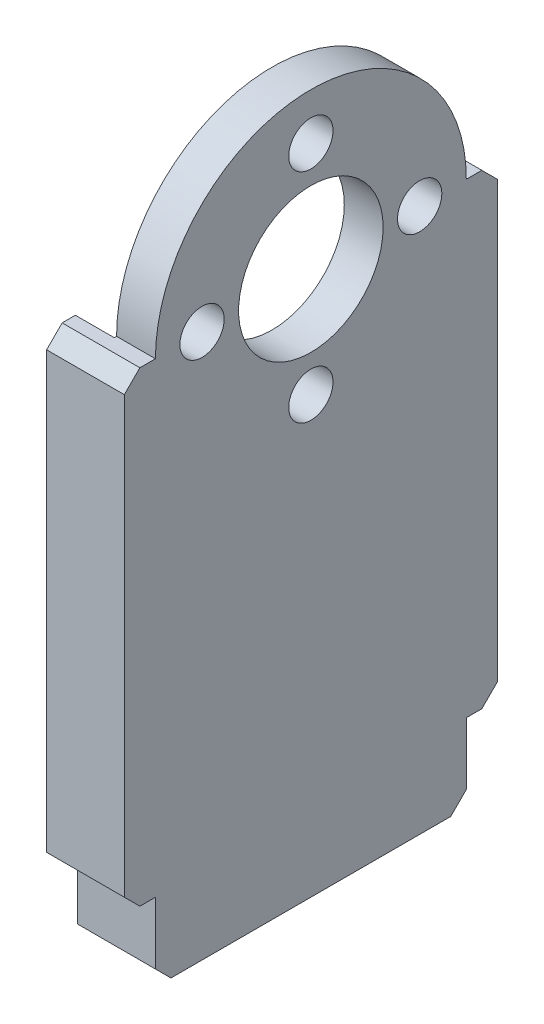
ISO-10303-21;
HEADER;
FILE_DESCRIPTION(('STEP AP214'),'2;1');
FILE_NAME('part.step','',(''),(''),'','','');
FILE_SCHEMA(('AUTOMOTIVE_DESIGN { 1 0 10303 214 1 1 1 1 }'));
ENDSEC;
DATA;
#1=APPLICATION_CONTEXT('core data for automotive mechanical design processes');
#2=APPLICATION_PROTOCOL_DEFINITION('international standard','automotive_design',2000,#1);
#3=PRODUCT_CONTEXT('',#1,'mechanical');
#4=PRODUCT('Part','Part','',(#3));
#5=PRODUCT_RELATED_PRODUCT_CATEGORY('part','',(#4));
#6=PRODUCT_DEFINITION_FORMATION('','',#4);
#7=PRODUCT_DEFINITION_CONTEXT('part definition',#1,'design');
#8=PRODUCT_DEFINITION('design','',#6,#7);
#9=PRODUCT_DEFINITION_SHAPE('','',#8);
#10=(LENGTH_UNIT() NAMED_UNIT(*) SI_UNIT(.MILLI.,.METRE.));
#11=(NAMED_UNIT(*) PLANE_ANGLE_UNIT() SI_UNIT($,.RADIAN.));
#12=(NAMED_UNIT(*) SI_UNIT($,.STERADIAN.) SOLID_ANGLE_UNIT());
#13=UNCERTAINTY_MEASURE_WITH_UNIT(LENGTH_MEASURE(1.E-05),#10,'distance_accuracy_value','');
#14=(GEOMETRIC_REPRESENTATION_CONTEXT(3) GLOBAL_UNCERTAINTY_ASSIGNED_CONTEXT((#13)) GLOBAL_UNIT_ASSIGNED_CONTEXT((#10,
#11,#12)) REPRESENTATION_CONTEXT('',''));
#15=CARTESIAN_POINT('',(0.,0.,0.));
#16=DIRECTION('',(0.,0.,1.));
#17=DIRECTION('',(1.,0.,0.));
#18=AXIS2_PLACEMENT_3D('',#15,#16,#17);
#19=CARTESIAN_POINT('',(-5.,0.,10.));
#20=DIRECTION('',(0.,0.,1.));
#21=DIRECTION('',(0.,-1.,0.));
#22=AXIS2_PLACEMENT_3D('',#19,#20,#21);
#23=PLANE('',#22);
#24=DIRECTION('',(0.,-1.,0.));
#25=VECTOR('',#24,1.);
#26=CARTESIAN_POINT('',(-5.,0.,10.));
#27=LINE('',#26,#25);
#28=CARTESIAN_POINT('',(-5.,0.,10.));
#29=VERTEX_POINT('',#28);
#30=CARTESIAN_POINT('',(-5.,-4.,10.));
#31=VERTEX_POINT('',#30);
#32=EDGE_CURVE('E270',#29,#31,#27,.T.);
#33=ORIENTED_EDGE('',*,*,#32,.T.);
#34=DIRECTION('',(1.,0.,0.));
#35=VECTOR('',#34,1.);
#36=CARTESIAN_POINT('',(-5.,-4.,10.));
#37=LINE('',#36,#35);
#38=CARTESIAN_POINT('',(0.,-4.,10.));
#39=VERTEX_POINT('',#38);
#40=EDGE_CURVE('E264',#31,#39,#37,.T.);
#41=ORIENTED_EDGE('',*,*,#40,.T.);
#42=DIRECTION('',(0.,-1.,0.));
#43=VECTOR('',#42,1.);
#44=CARTESIAN_POINT('',(0.,0.,10.));
#45=LINE('',#44,#43);
#46=CARTESIAN_POINT('',(0.,0.,10.));
#47=VERTEX_POINT('',#46);
#48=EDGE_CURVE('E410',#47,#39,#45,.T.);
#49=ORIENTED_EDGE('',*,*,#48,.F.);
#50=DIRECTION('',(1.,0.,0.));
#51=VECTOR('',#50,1.);
#52=CARTESIAN_POINT('',(-35.0665927567458,0.,10.));
#53=LINE('',#52,#51);
#54=EDGE_CURVE('E421',#29,#47,#53,.T.);
#55=ORIENTED_EDGE('',*,*,#54,.F.);
#56=EDGE_LOOP('',(#33,#41,#49,#55));
#57=FACE_BOUND('',#56,.T.);
#58=ADVANCED_FACE('F46',(#57),#23,.T.);
#59=CARTESIAN_POINT('',(-2.5,30.,0.));
#60=DIRECTION('',(1.,0.,0.));
#61=DIRECTION('',(0.,0.,-1.));
#62=AXIS2_PLACEMENT_3D('',#59,#60,#61);
#63=CYLINDRICAL_SURFACE('',#62,10.);
#64=CARTESIAN_POINT('',(0.,30.,0.));
#65=DIRECTION('',(1.,0.,0.));
#66=DIRECTION('',(0.,0.,-1.));
#67=AXIS2_PLACEMENT_3D('',#64,#65,#66);
#68=CIRCLE('',#67,10.);
#69=CARTESIAN_POINT('',(0.,30.,-10.));
#70=VERTEX_POINT('',#69);
#71=CARTESIAN_POINT('',(0.,30.,9.99999999999998));
#72=VERTEX_POINT('',#71);
#73=EDGE_CURVE('E191',#70,#72,#68,.T.);
#74=ORIENTED_EDGE('',*,*,#73,.F.);
#75=DIRECTION('',(1.,0.,0.));
#76=VECTOR('',#75,1.);
#77=CARTESIAN_POINT('',(-5.,30.,-10.));
#78=LINE('',#77,#76);
#79=CARTESIAN_POINT('',(-2.5,30.,-10.));
#80=VERTEX_POINT('',#79);
#81=EDGE_CURVE('E177',#80,#70,#78,.T.);
#82=ORIENTED_EDGE('',*,*,#81,.F.);
#83=CARTESIAN_POINT('',(-2.5,30.,0.));
#84=DIRECTION('',(1.,0.,0.));
#85=DIRECTION('',(0.,0.,-1.));
#86=AXIS2_PLACEMENT_3D('',#83,#84,#85);
#87=CIRCLE('',#86,10.);
#88=CARTESIAN_POINT('',(-2.5,30.,9.99999999999998));
#89=VERTEX_POINT('',#88);
#90=EDGE_CURVE('E211',#80,#89,#87,.T.);
#91=ORIENTED_EDGE('',*,*,#90,.T.);
#92=DIRECTION('',(1.,0.,0.));
#93=VECTOR('',#92,1.);
#94=CARTESIAN_POINT('',(-5.,30.,9.99999999999998));
#95=LINE('',#94,#93);
#96=EDGE_CURVE('E200',#89,#72,#95,.T.);
#97=ORIENTED_EDGE('',*,*,#96,.T.);
#98=EDGE_LOOP('',(#74,#82,#91,#97));
#99=FACE_BOUND('',#98,.T.);
#100=ADVANCED_FACE('F198',(#99),#63,.T.);
#101=CARTESIAN_POINT('',(-2.5,30.,0.));
#102=DIRECTION('',(1.,0.,0.));
#103=DIRECTION('',(0.,0.,-1.));
#104=AXIS2_PLACEMENT_3D('',#101,#102,#103);
#105=CYLINDRICAL_SURFACE('',#104,4.65);
#106=CARTESIAN_POINT('',(-2.5,30.,0.));
#107=DIRECTION('',(1.,0.,0.));
#108=DIRECTION('',(0.,0.,-1.));
#109=AXIS2_PLACEMENT_3D('',#106,#107,#108);
#110=CIRCLE('',#109,4.65);
#111=CARTESIAN_POINT('',(-2.5,30.,-4.64999999999999));
#112=VERTEX_POINT('',#111);
#113=EDGE_CURVE('E276',#112,#112,#110,.T.);
#114=ORIENTED_EDGE('',*,*,#113,.F.);
#115=EDGE_LOOP('',(#114));
#116=FACE_BOUND('',#115,.T.);
#117=CARTESIAN_POINT('',(0.,30.,0.));
#118=DIRECTION('',(1.,0.,0.));
#119=DIRECTION('',(0.,0.,-1.));
#120=AXIS2_PLACEMENT_3D('',#117,#118,#119);
#121=CIRCLE('',#120,4.65);
#122=CARTESIAN_POINT('',(0.,30.,-4.64999999999999));
#123=VERTEX_POINT('',#122);
#124=EDGE_CURVE('E202',#123,#123,#121,.T.);
#125=ORIENTED_EDGE('',*,*,#124,.T.);
#126=EDGE_LOOP('',(#125));
#127=FACE_BOUND('',#126,.T.);
#128=ADVANCED_FACE('F48',(#116,#127),#105,.F.);
#129=CARTESIAN_POINT('',(-2.5,30.,-7.));
#130=DIRECTION('',(1.,0.,0.));
#131=DIRECTION('',(0.,0.,-1.));
#132=AXIS2_PLACEMENT_3D('',#129,#130,#131);
#133=CYLINDRICAL_SURFACE('',#132,1.425);
#134=CARTESIAN_POINT('',(-2.5,30.,-7.));
#135=DIRECTION('',(1.,0.,0.));
#136=DIRECTION('',(0.,0.,-1.));
#137=AXIS2_PLACEMENT_3D('',#134,#135,#136);
#138=CIRCLE('',#137,1.425);
#139=CARTESIAN_POINT('',(-2.5,30.,-8.42499999999999));
#140=VERTEX_POINT('',#139);
#141=EDGE_CURVE('E278',#140,#140,#138,.T.);
#142=ORIENTED_EDGE('',*,*,#141,.F.);
#143=EDGE_LOOP('',(#142));
#144=FACE_BOUND('',#143,.T.);
#145=CARTESIAN_POINT('',(0.,30.,-7.));
#146=DIRECTION('',(1.,0.,0.));
#147=DIRECTION('',(0.,0.,-1.));
#148=AXIS2_PLACEMENT_3D('',#145,#146,#147);
#149=CIRCLE('',#148,1.425);
#150=CARTESIAN_POINT('',(0.,30.,-8.42499999999999));
#151=VERTEX_POINT('',#150);
#152=EDGE_CURVE('E207',#151,#151,#149,.T.);
#153=ORIENTED_EDGE('',*,*,#152,.T.);
#154=EDGE_LOOP('',(#153));
#155=FACE_BOUND('',#154,.T.);
#156=ADVANCED_FACE('F309',(#144,#155),#133,.F.);
#157=CARTESIAN_POINT('',(-2.5,22.9999999999998,-1.73472347597681E-13));
#158=DIRECTION('',(1.,0.,0.));
#159=DIRECTION('',(0.,0.,-1.));
#160=AXIS2_PLACEMENT_3D('',#157,#158,#159);
#161=CYLINDRICAL_SURFACE('',#160,1.425);
#162=CARTESIAN_POINT('',(-2.5,22.9999999999998,-1.73472347597681E-13));
#163=DIRECTION('',(1.,0.,0.));
#164=DIRECTION('',(0.,0.,-1.));
#165=AXIS2_PLACEMENT_3D('',#162,#163,#164);
#166=CIRCLE('',#165,1.425);
#167=CARTESIAN_POINT('',(-2.5,22.9999999999998,-1.42500000000017));
#168=VERTEX_POINT('',#167);
#169=EDGE_CURVE('E282',#168,#168,#166,.T.);
#170=ORIENTED_EDGE('',*,*,#169,.F.);
#171=EDGE_LOOP('',(#170));
#172=FACE_BOUND('',#171,.T.);
#173=CARTESIAN_POINT('',(0.,22.9999999999998,-1.73472347597681E-13));
#174=DIRECTION('',(1.,0.,0.));
#175=DIRECTION('',(0.,0.,-1.));
#176=AXIS2_PLACEMENT_3D('',#173,#174,#175);
#177=CIRCLE('',#176,1.425);
#178=CARTESIAN_POINT('',(0.,22.9999999999998,-1.42500000000017));
#179=VERTEX_POINT('',#178);
#180=EDGE_CURVE('E286',#179,#179,#177,.T.);
#181=ORIENTED_EDGE('',*,*,#180,.T.);
#182=EDGE_LOOP('',(#181));
#183=FACE_BOUND('',#182,.T.);
#184=ADVANCED_FACE('F296',(#172,#183),#161,.F.);
#185=CARTESIAN_POINT('',(-2.5,29.9999999999997,7.));
#186=DIRECTION('',(1.,0.,0.));
#187=DIRECTION('',(0.,0.,-1.));
#188=AXIS2_PLACEMENT_3D('',#185,#186,#187);
#189=CYLINDRICAL_SURFACE('',#188,1.425);
#190=CARTESIAN_POINT('',(-2.5,29.9999999999997,7.));
#191=DIRECTION('',(1.,0.,0.));
#192=DIRECTION('',(0.,0.,-1.));
#193=AXIS2_PLACEMENT_3D('',#190,#191,#192);
#194=CIRCLE('',#193,1.425);
#195=CARTESIAN_POINT('',(-2.5,29.9999999999997,5.57500000000001));
#196=VERTEX_POINT('',#195);
#197=EDGE_CURVE('E205',#196,#196,#194,.T.);
#198=ORIENTED_EDGE('',*,*,#197,.F.);
#199=EDGE_LOOP('',(#198));
#200=FACE_BOUND('',#199,.T.);
#201=CARTESIAN_POINT('',(0.,29.9999999999997,7.));
#202=DIRECTION('',(1.,0.,0.));
#203=DIRECTION('',(0.,0.,-1.));
#204=AXIS2_PLACEMENT_3D('',#201,#202,#203);
#205=CIRCLE('',#204,1.425);
#206=CARTESIAN_POINT('',(0.,29.9999999999997,5.57500000000001));
#207=VERTEX_POINT('',#206);
#208=EDGE_CURVE('E283',#207,#207,#205,.T.);
#209=ORIENTED_EDGE('',*,*,#208,.T.);
#210=EDGE_LOOP('',(#209));
#211=FACE_BOUND('',#210,.T.);
#212=ADVANCED_FACE('F382',(#200,#211),#189,.F.);
#213=CARTESIAN_POINT('',(-2.5,36.9999999999998,1.31838984174237E-13));
#214=DIRECTION('',(1.,0.,0.));
#215=DIRECTION('',(0.,0.,-1.));
#216=AXIS2_PLACEMENT_3D('',#213,#214,#215);
#217=CYLINDRICAL_SURFACE('',#216,1.42499999999999);
#218=CARTESIAN_POINT('',(-2.5,36.9999999999998,1.31838984174237E-13));
#219=DIRECTION('',(1.,0.,0.));
#220=DIRECTION('',(0.,0.,-1.));
#221=AXIS2_PLACEMENT_3D('',#218,#219,#220);
#222=CIRCLE('',#221,1.42499999999999);
#223=CARTESIAN_POINT('',(-2.5,36.9999999999998,-1.42499999999986));
#224=VERTEX_POINT('',#223);
#225=EDGE_CURVE('E201',#224,#224,#222,.T.);
#226=ORIENTED_EDGE('',*,*,#225,.F.);
#227=EDGE_LOOP('',(#226));
#228=FACE_BOUND('',#227,.T.);
#229=CARTESIAN_POINT('',(0.,36.9999999999998,1.31838984174237E-13));
#230=DIRECTION('',(1.,0.,0.));
#231=DIRECTION('',(0.,0.,-1.));
#232=AXIS2_PLACEMENT_3D('',#229,#230,#231);
#233=CIRCLE('',#232,1.42499999999999);
#234=CARTESIAN_POINT('',(0.,36.9999999999998,-1.42499999999986));
#235=VERTEX_POINT('',#234);
#236=EDGE_CURVE('E50',#235,#235,#233,.T.);
#237=ORIENTED_EDGE('',*,*,#236,.T.);
#238=EDGE_LOOP('',(#237));
#239=FACE_BOUND('',#238,.T.);
#240=ADVANCED_FACE('F332',(#228,#239),#217,.F.);
#241=CARTESIAN_POINT('',(-2.5,0.,0.));
#242=DIRECTION('',(1.,0.,0.));
#243=DIRECTION('',(0.,0.,-1.));
#244=AXIS2_PLACEMENT_3D('',#241,#242,#243);
#245=PLANE('',#244);
#246=ORIENTED_EDGE('',*,*,#225,.T.);
#247=EDGE_LOOP('',(#246));
#248=FACE_BOUND('',#247,.T.);
#249=ORIENTED_EDGE('',*,*,#197,.T.);
#250=EDGE_LOOP('',(#249));
#251=FACE_BOUND('',#250,.T.);
#252=ORIENTED_EDGE('',*,*,#169,.T.);
#253=EDGE_LOOP('',(#252));
#254=FACE_BOUND('',#253,.T.);
#255=ORIENTED_EDGE('',*,*,#141,.T.);
#256=EDGE_LOOP('',(#255));
#257=FACE_BOUND('',#256,.T.);
#258=ORIENTED_EDGE('',*,*,#113,.T.);
#259=EDGE_LOOP('',(#258));
#260=FACE_BOUND('',#259,.T.);
#261=ORIENTED_EDGE('',*,*,#90,.F.);
#262=DIRECTION('',(0.,0.,-1.));
#263=VECTOR('',#262,1.);
#264=CARTESIAN_POINT('',(-2.5,30.,0.));
#265=LINE('',#264,#263);
#266=CARTESIAN_POINT('',(-2.5,30.,-10.15));
#267=VERTEX_POINT('',#266);
#268=EDGE_CURVE('E12',#80,#267,#265,.T.);
#269=ORIENTED_EDGE('',*,*,#268,.T.);
#270=CARTESIAN_POINT('',(-2.5,30.,0.));
#271=DIRECTION('',(1.,0.,0.));
#272=DIRECTION('',(0.,0.,-1.));
#273=AXIS2_PLACEMENT_3D('',#270,#271,#272);
#274=CIRCLE('',#273,10.15);
#275=CARTESIAN_POINT('',(-2.5,30.,10.15));
#276=VERTEX_POINT('',#275);
#277=EDGE_CURVE('E273',#276,#267,#274,.T.);
#278=ORIENTED_EDGE('',*,*,#277,.F.);
#279=DIRECTION('',(0.,0.,1.));
#280=VECTOR('',#279,1.);
#281=CARTESIAN_POINT('',(-2.5,30.,0.));
#282=LINE('',#281,#280);
#283=EDGE_CURVE('E56',#89,#276,#282,.T.);
#284=ORIENTED_EDGE('',*,*,#283,.F.);
#285=EDGE_LOOP('',(#261,#269,#278,#284));
#286=FACE_BOUND('',#285,.T.);
#287=ADVANCED_FACE('F301',(#248,#251,#254,#257,#260,#286),#245,.F.);
#288=CARTESIAN_POINT('',(0.,0.,0.));
#289=DIRECTION('',(1.,0.,0.));
#290=DIRECTION('',(0.,0.,-1.));
#291=AXIS2_PLACEMENT_3D('',#288,#289,#290);
#292=PLANE('',#291);
#293=ORIENTED_EDGE('',*,*,#236,.F.);
#294=EDGE_LOOP('',(#293));
#295=FACE_BOUND('',#294,.T.);
#296=ORIENTED_EDGE('',*,*,#208,.F.);
#297=EDGE_LOOP('',(#296));
#298=FACE_BOUND('',#297,.T.);
#299=ORIENTED_EDGE('',*,*,#180,.F.);
#300=EDGE_LOOP('',(#299));
#301=FACE_BOUND('',#300,.T.);
#302=ORIENTED_EDGE('',*,*,#152,.F.);
#303=EDGE_LOOP('',(#302));
#304=FACE_BOUND('',#303,.T.);
#305=ORIENTED_EDGE('',*,*,#124,.F.);
#306=EDGE_LOOP('',(#305));
#307=FACE_BOUND('',#306,.T.);
#308=DIRECTION('',(0.,0.,1.));
#309=VECTOR('',#308,1.);
#310=CARTESIAN_POINT('',(0.,-5.,-10.));
#311=LINE('',#310,#309);
#312=CARTESIAN_POINT('',(0.,-5.,-9.));
#313=VERTEX_POINT('',#312);
#314=CARTESIAN_POINT('',(0.,-5.,9.));
#315=VERTEX_POINT('',#314);
#316=EDGE_CURVE('E417',#313,#315,#311,.T.);
#317=ORIENTED_EDGE('',*,*,#316,.F.);
#318=DIRECTION('',(0.,0.707106781186548,-0.707106781186548));
#319=VECTOR('',#318,1.);
#320=CARTESIAN_POINT('',(0.,-7.,-7.));
#321=LINE('',#320,#319);
#322=CARTESIAN_POINT('',(0.,-4.,-10.));
#323=VERTEX_POINT('',#322);
#324=EDGE_CURVE('E256',#313,#323,#321,.T.);
#325=ORIENTED_EDGE('',*,*,#324,.T.);
#326=DIRECTION('',(0.,-1.,0.));
#327=VECTOR('',#326,1.);
#328=CARTESIAN_POINT('',(0.,0.,-10.));
#329=LINE('',#328,#327);
#330=CARTESIAN_POINT('',(0.,0.,-10.));
#331=VERTEX_POINT('',#330);
#332=EDGE_CURVE('E271',#331,#323,#329,.T.);
#333=ORIENTED_EDGE('',*,*,#332,.F.);
#334=DIRECTION('',(0.,0.,-1.));
#335=VECTOR('',#334,1.);
#336=CARTESIAN_POINT('',(0.,0.,0.));
#337=LINE('',#336,#335);
#338=CARTESIAN_POINT('',(0.,0.,-11.));
#339=VERTEX_POINT('',#338);
#340=EDGE_CURVE('E433',#331,#339,#337,.T.);
#341=ORIENTED_EDGE('',*,*,#340,.T.);
#342=DIRECTION('',(0.,-0.707106781186548,0.707106781186548));
#343=VECTOR('',#342,1.);
#344=CARTESIAN_POINT('',(0.,-5.49999999999999,-5.49999999999999));
#345=LINE('',#344,#343);
#346=CARTESIAN_POINT('',(0.,1.00000000000002,-12.));
#347=VERTEX_POINT('',#346);
#348=EDGE_CURVE('E221',#339,#347,#345,.F.);
#349=ORIENTED_EDGE('',*,*,#348,.T.);
#350=DIRECTION('',(0.,1.,0.));
#351=VECTOR('',#350,1.);
#352=CARTESIAN_POINT('',(0.,0.,-12.));
#353=LINE('',#352,#351);
#354=CARTESIAN_POINT('',(0.,29.,-12.));
#355=VERTEX_POINT('',#354);
#356=EDGE_CURVE('E196',#347,#355,#353,.T.);
#357=ORIENTED_EDGE('',*,*,#356,.T.);
#358=DIRECTION('',(0.,0.707106781186548,0.707106781186548));
#359=VECTOR('',#358,1.);
#360=CARTESIAN_POINT('',(0.,20.5,-20.5));
#361=LINE('',#360,#359);
#362=CARTESIAN_POINT('',(0.,30.,-11.));
#363=VERTEX_POINT('',#362);
#364=EDGE_CURVE('E194',#355,#363,#361,.T.);
#365=ORIENTED_EDGE('',*,*,#364,.T.);
#366=DIRECTION('',(0.,0.,-1.));
#367=VECTOR('',#366,1.);
#368=CARTESIAN_POINT('',(0.,30.,0.));
#369=LINE('',#368,#367);
#370=EDGE_CURVE('E180',#70,#363,#369,.T.);
#371=ORIENTED_EDGE('',*,*,#370,.F.);
#372=ORIENTED_EDGE('',*,*,#73,.T.);
#373=DIRECTION('',(0.,0.,1.));
#374=VECTOR('',#373,1.);
#375=CARTESIAN_POINT('',(0.,30.,0.));
#376=LINE('',#375,#374);
#377=CARTESIAN_POINT('',(0.,30.,11.));
#378=VERTEX_POINT('',#377);
#379=EDGE_CURVE('E403',#72,#378,#376,.T.);
#380=ORIENTED_EDGE('',*,*,#379,.T.);
#381=DIRECTION('',(0.,0.707106781186546,-0.707106781186549));
#382=VECTOR('',#381,1.);
#383=CARTESIAN_POINT('',(0.,20.5,20.5));
#384=LINE('',#383,#382);
#385=CARTESIAN_POINT('',(0.,29.,12.));
#386=VERTEX_POINT('',#385);
#387=EDGE_CURVE('E216',#378,#386,#384,.F.);
#388=ORIENTED_EDGE('',*,*,#387,.T.);
#389=DIRECTION('',(0.,-1.,0.));
#390=VECTOR('',#389,1.);
#391=CARTESIAN_POINT('',(0.,0.,12.));
#392=LINE('',#391,#390);
#393=CARTESIAN_POINT('',(0.,1.00000000000002,12.));
#394=VERTEX_POINT('',#393);
#395=EDGE_CURVE('E424',#386,#394,#392,.T.);
#396=ORIENTED_EDGE('',*,*,#395,.T.);
#397=DIRECTION('',(0.,-0.707106781186548,-0.707106781186548));
#398=VECTOR('',#397,1.);
#399=CARTESIAN_POINT('',(0.,-5.49999999999998,5.49999999999998));
#400=LINE('',#399,#398);
#401=CARTESIAN_POINT('',(0.,0.,11.));
#402=VERTEX_POINT('',#401);
#403=EDGE_CURVE('E219',#394,#402,#400,.T.);
#404=ORIENTED_EDGE('',*,*,#403,.T.);
#405=DIRECTION('',(0.,0.,1.));
#406=VECTOR('',#405,1.);
#407=CARTESIAN_POINT('',(0.,0.,0.));
#408=LINE('',#407,#406);
#409=EDGE_CURVE('E428',#47,#402,#408,.T.);
#410=ORIENTED_EDGE('',*,*,#409,.F.);
#411=ORIENTED_EDGE('',*,*,#48,.T.);
#412=DIRECTION('',(0.,0.707106781186548,0.707106781186548));
#413=VECTOR('',#412,1.);
#414=CARTESIAN_POINT('',(0.,-7.,7.));
#415=LINE('',#414,#413);
#416=EDGE_CURVE('E254',#39,#315,#415,.F.);
#417=ORIENTED_EDGE('',*,*,#416,.T.);
#418=EDGE_LOOP('',(#317,#325,#333,#341,#349,#357,#365,#371,#372,#380,#388,#396,#404,#410,#411,#417));
#419=FACE_BOUND('',#418,.T.);
#420=ADVANCED_FACE('F189',(#295,#298,#301,#304,#307,#419),#292,.T.);
#421=CARTESIAN_POINT('',(-5.,30.,0.));
#422=DIRECTION('',(1.,0.,0.));
#423=DIRECTION('',(0.,0.,-1.));
#424=AXIS2_PLACEMENT_3D('',#421,#422,#423);
#425=CYLINDRICAL_SURFACE('',#424,10.15);
#426=DIRECTION('',(1.,0.,0.));
#427=VECTOR('',#426,1.);
#428=CARTESIAN_POINT('',(-5.,30.,10.15));
#429=LINE('',#428,#427);
#430=CARTESIAN_POINT('',(-5.,30.,10.15));
#431=VERTEX_POINT('',#430);
#432=EDGE_CURVE('E184',#431,#276,#429,.T.);
#433=ORIENTED_EDGE('',*,*,#432,.T.);
#434=ORIENTED_EDGE('',*,*,#277,.T.);
#435=DIRECTION('',(1.,0.,0.));
#436=VECTOR('',#435,1.);
#437=CARTESIAN_POINT('',(-5.,30.,-10.15));
#438=LINE('',#437,#436);
#439=CARTESIAN_POINT('',(-5.,30.,-10.15));
#440=VERTEX_POINT('',#439);
#441=EDGE_CURVE('E65',#440,#267,#438,.T.);
#442=ORIENTED_EDGE('',*,*,#441,.F.);
#443=CARTESIAN_POINT('',(-5.,30.,0.));
#444=DIRECTION('',(1.,0.,0.));
#445=DIRECTION('',(0.,0.,-1.));
#446=AXIS2_PLACEMENT_3D('',#443,#444,#445);
#447=CIRCLE('',#446,10.15);
#448=EDGE_CURVE('E268',#431,#440,#447,.T.);
#449=ORIENTED_EDGE('',*,*,#448,.F.);
#450=EDGE_LOOP('',(#433,#434,#442,#449));
#451=FACE_BOUND('',#450,.T.);
#452=ADVANCED_FACE('F300',(#451),#425,.F.);
#453=CARTESIAN_POINT('',(-5.,0.,-10.));
#454=DIRECTION('',(0.,0.,1.));
#455=DIRECTION('',(1.,0.,0.));
#456=AXIS2_PLACEMENT_3D('',#453,#454,#455);
#457=PLANE('',#456);
#458=ORIENTED_EDGE('',*,*,#332,.T.);
#459=DIRECTION('',(-1.,0.,0.));
#460=VECTOR('',#459,1.);
#461=CARTESIAN_POINT('',(-5.,-4.,-10.));
#462=LINE('',#461,#460);
#463=CARTESIAN_POINT('',(-5.,-4.,-10.));
#464=VERTEX_POINT('',#463);
#465=EDGE_CURVE('E258',#323,#464,#462,.T.);
#466=ORIENTED_EDGE('',*,*,#465,.T.);
#467=DIRECTION('',(0.,-1.,0.));
#468=VECTOR('',#467,1.);
#469=CARTESIAN_POINT('',(-5.,0.,-10.));
#470=LINE('',#469,#468);
#471=CARTESIAN_POINT('',(-5.,0.,-10.));
#472=VERTEX_POINT('',#471);
#473=EDGE_CURVE('E404',#472,#464,#470,.T.);
#474=ORIENTED_EDGE('',*,*,#473,.F.);
#475=DIRECTION('',(1.,0.,0.));
#476=VECTOR('',#475,1.);
#477=CARTESIAN_POINT('',(-35.0665927567458,0.,-10.));
#478=LINE('',#477,#476);
#479=EDGE_CURVE('E195',#472,#331,#478,.T.);
#480=ORIENTED_EDGE('',*,*,#479,.T.);
#481=EDGE_LOOP('',(#458,#466,#474,#480));
#482=FACE_BOUND('',#481,.T.);
#483=ADVANCED_FACE('F329',(#482),#457,.F.);
#484=CARTESIAN_POINT('',(-5.,0.,0.));
#485=DIRECTION('',(1.,0.,0.));
#486=DIRECTION('',(0.,0.,-1.));
#487=AXIS2_PLACEMENT_3D('',#484,#485,#486);
#488=PLANE('',#487);
#489=ORIENTED_EDGE('',*,*,#473,.T.);
#490=DIRECTION('',(0.,-0.707106781186548,0.707106781186548));
#491=VECTOR('',#490,1.);
#492=CARTESIAN_POINT('',(-5.,-5.,-9.));
#493=LINE('',#492,#491);
#494=CARTESIAN_POINT('',(-5.,-5.,-9.));
#495=VERTEX_POINT('',#494);
#496=EDGE_CURVE('E262',#464,#495,#493,.T.);
#497=ORIENTED_EDGE('',*,*,#496,.T.);
#498=DIRECTION('',(0.,0.,-1.));
#499=VECTOR('',#498,1.);
#500=CARTESIAN_POINT('',(-5.,-5.,10.));
#501=LINE('',#500,#499);
#502=CARTESIAN_POINT('',(-5.,-5.,9.));
#503=VERTEX_POINT('',#502);
#504=EDGE_CURVE('E412',#503,#495,#501,.T.);
#505=ORIENTED_EDGE('',*,*,#504,.F.);
#506=DIRECTION('',(0.,-0.707106781186548,-0.707106781186548));
#507=VECTOR('',#506,1.);
#508=CARTESIAN_POINT('',(-5.,-5.,9.));
#509=LINE('',#508,#507);
#510=EDGE_CURVE('E260',#503,#31,#509,.F.);
#511=ORIENTED_EDGE('',*,*,#510,.T.);
#512=ORIENTED_EDGE('',*,*,#32,.F.);
#513=DIRECTION('',(0.,0.,-1.));
#514=VECTOR('',#513,1.);
#515=CARTESIAN_POINT('',(-5.,0.,0.));
#516=LINE('',#515,#514);
#517=CARTESIAN_POINT('',(-5.,0.,11.));
#518=VERTEX_POINT('',#517);
#519=EDGE_CURVE('E431',#518,#29,#516,.T.);
#520=ORIENTED_EDGE('',*,*,#519,.F.);
#521=DIRECTION('',(0.,0.707106781186548,0.707106781186548));
#522=VECTOR('',#521,1.);
#523=CARTESIAN_POINT('',(-5.,1.00000000000002,12.));
#524=LINE('',#523,#522);
#525=CARTESIAN_POINT('',(-5.,1.00000000000002,12.));
#526=VERTEX_POINT('',#525);
#527=EDGE_CURVE('E232',#518,#526,#524,.T.);
#528=ORIENTED_EDGE('',*,*,#527,.T.);
#529=DIRECTION('',(0.,1.,0.));
#530=VECTOR('',#529,1.);
#531=CARTESIAN_POINT('',(-5.,0.,12.));
#532=LINE('',#531,#530);
#533=CARTESIAN_POINT('',(-5.,29.,12.));
#534=VERTEX_POINT('',#533);
#535=EDGE_CURVE('E434',#526,#534,#532,.T.);
#536=ORIENTED_EDGE('',*,*,#535,.T.);
#537=DIRECTION('',(0.,-0.707106781186546,0.707106781186549));
#538=VECTOR('',#537,1.);
#539=CARTESIAN_POINT('',(-5.,30.,11.));
#540=LINE('',#539,#538);
#541=CARTESIAN_POINT('',(-5.,30.,11.));
#542=VERTEX_POINT('',#541);
#543=EDGE_CURVE('E228',#534,#542,#540,.F.);
#544=ORIENTED_EDGE('',*,*,#543,.T.);
#545=DIRECTION('',(0.,0.,-1.));
#546=VECTOR('',#545,1.);
#547=CARTESIAN_POINT('',(-5.,30.,0.));
#548=LINE('',#547,#546);
#549=EDGE_CURVE('E90',#542,#431,#548,.T.);
#550=ORIENTED_EDGE('',*,*,#549,.T.);
#551=ORIENTED_EDGE('',*,*,#448,.T.);
#552=DIRECTION('',(0.,0.,1.));
#553=VECTOR('',#552,1.);
#554=CARTESIAN_POINT('',(-5.,30.,0.));
#555=LINE('',#554,#553);
#556=CARTESIAN_POINT('',(-5.,30.,-11.));
#557=VERTEX_POINT('',#556);
#558=EDGE_CURVE('E442',#557,#440,#555,.T.);
#559=ORIENTED_EDGE('',*,*,#558,.F.);
#560=DIRECTION('',(0.,-0.707106781186548,-0.707106781186548));
#561=VECTOR('',#560,1.);
#562=CARTESIAN_POINT('',(-5.,29.,-12.));
#563=LINE('',#562,#561);
#564=CARTESIAN_POINT('',(-5.,29.,-12.));
#565=VERTEX_POINT('',#564);
#566=EDGE_CURVE('E230',#557,#565,#563,.T.);
#567=ORIENTED_EDGE('',*,*,#566,.T.);
#568=DIRECTION('',(0.,-1.,0.));
#569=VECTOR('',#568,1.);
#570=CARTESIAN_POINT('',(-5.,0.,-12.));
#571=LINE('',#570,#569);
#572=CARTESIAN_POINT('',(-5.,1.00000000000002,-12.));
#573=VERTEX_POINT('',#572);
#574=EDGE_CURVE('E420',#565,#573,#571,.T.);
#575=ORIENTED_EDGE('',*,*,#574,.T.);
#576=DIRECTION('',(0.,0.707106781186548,-0.707106781186548));
#577=VECTOR('',#576,1.);
#578=CARTESIAN_POINT('',(-5.,0.,-11.));
#579=LINE('',#578,#577);
#580=CARTESIAN_POINT('',(-5.,0.,-11.));
#581=VERTEX_POINT('',#580);
#582=EDGE_CURVE('E234',#573,#581,#579,.F.);
#583=ORIENTED_EDGE('',*,*,#582,.T.);
#584=DIRECTION('',(0.,0.,1.));
#585=VECTOR('',#584,1.);
#586=CARTESIAN_POINT('',(-5.,0.,0.));
#587=LINE('',#586,#585);
#588=EDGE_CURVE('E440',#581,#472,#587,.T.);
#589=ORIENTED_EDGE('',*,*,#588,.T.);
#590=EDGE_LOOP('',(#489,#497,#505,#511,#512,#520,#528,#536,#544,#550,#551,#559,#567,#575,#583,#589));
#591=FACE_BOUND('',#590,.T.);
#592=ADVANCED_FACE('F450',(#591),#488,.F.);
#593=CARTESIAN_POINT('',(0.,-5.,0.));
#594=DIRECTION('',(0.,-1.,0.));
#595=DIRECTION('',(0.,0.,-1.));
#596=AXIS2_PLACEMENT_3D('',#593,#594,#595);
#597=PLANE('',#596);
#598=ORIENTED_EDGE('',*,*,#504,.T.);
#599=DIRECTION('',(1.,0.,0.));
#600=VECTOR('',#599,1.);
#601=CARTESIAN_POINT('',(0.,-5.,-9.));
#602=LINE('',#601,#600);
#603=EDGE_CURVE('E251',#495,#313,#602,.T.);
#604=ORIENTED_EDGE('',*,*,#603,.T.);
#605=ORIENTED_EDGE('',*,*,#316,.T.);
#606=DIRECTION('',(-1.,0.,0.));
#607=VECTOR('',#606,1.);
#608=CARTESIAN_POINT('',(0.,-5.,9.));
#609=LINE('',#608,#607);
#610=EDGE_CURVE('E248',#315,#503,#609,.T.);
#611=ORIENTED_EDGE('',*,*,#610,.T.);
#612=EDGE_LOOP('',(#598,#604,#605,#611));
#613=FACE_BOUND('',#612,.T.);
#614=ADVANCED_FACE('F472',(#613),#597,.T.);
#615=CARTESIAN_POINT('',(-35.0665927567458,30.,0.));
#616=DIRECTION('',(0.,1.,0.));
#617=DIRECTION('',(0.,0.,1.));
#618=AXIS2_PLACEMENT_3D('',#615,#616,#617);
#619=PLANE('',#618);
#620=ORIENTED_EDGE('',*,*,#549,.F.);
#621=DIRECTION('',(1.,0.,0.));
#622=VECTOR('',#621,1.);
#623=CARTESIAN_POINT('',(-35.0665927567458,30.,11.));
#624=LINE('',#623,#622);
#625=EDGE_CURVE('E245',#542,#378,#624,.T.);
#626=ORIENTED_EDGE('',*,*,#625,.T.);
#627=ORIENTED_EDGE('',*,*,#379,.F.);
#628=ORIENTED_EDGE('',*,*,#96,.F.);
#629=ORIENTED_EDGE('',*,*,#283,.T.);
#630=ORIENTED_EDGE('',*,*,#432,.F.);
#631=EDGE_LOOP('',(#620,#626,#627,#628,#629,#630));
#632=FACE_BOUND('',#631,.T.);
#633=ADVANCED_FACE('F401',(#632),#619,.T.);
#634=CARTESIAN_POINT('',(-35.0665927567458,0.,12.));
#635=DIRECTION('',(0.,0.,1.));
#636=DIRECTION('',(0.,-1.,0.));
#637=AXIS2_PLACEMENT_3D('',#634,#635,#636);
#638=PLANE('',#637);
#639=ORIENTED_EDGE('',*,*,#535,.F.);
#640=DIRECTION('',(1.,0.,0.));
#641=VECTOR('',#640,1.);
#642=CARTESIAN_POINT('',(0.,1.00000000000002,12.));
#643=LINE('',#642,#641);
#644=EDGE_CURVE('E238',#526,#394,#643,.T.);
#645=ORIENTED_EDGE('',*,*,#644,.T.);
#646=ORIENTED_EDGE('',*,*,#395,.F.);
#647=DIRECTION('',(-1.,0.,0.));
#648=VECTOR('',#647,1.);
#649=CARTESIAN_POINT('',(-35.0665927567458,29.,12.));
#650=LINE('',#649,#648);
#651=EDGE_CURVE('E236',#386,#534,#650,.T.);
#652=ORIENTED_EDGE('',*,*,#651,.T.);
#653=EDGE_LOOP('',(#639,#645,#646,#652));
#654=FACE_BOUND('',#653,.T.);
#655=ADVANCED_FACE('F457',(#654),#638,.T.);
#656=CARTESIAN_POINT('',(-35.0665927567458,0.,0.));
#657=DIRECTION('',(0.,1.,0.));
#658=DIRECTION('',(0.,0.,1.));
#659=AXIS2_PLACEMENT_3D('',#656,#657,#658);
#660=PLANE('',#659);
#661=ORIENTED_EDGE('',*,*,#409,.T.);
#662=DIRECTION('',(-1.,0.,0.));
#663=VECTOR('',#662,1.);
#664=CARTESIAN_POINT('',(-5.,0.,11.));
#665=LINE('',#664,#663);
#666=EDGE_CURVE('E241',#402,#518,#665,.T.);
#667=ORIENTED_EDGE('',*,*,#666,.T.);
#668=ORIENTED_EDGE('',*,*,#519,.T.);
#669=ORIENTED_EDGE('',*,*,#54,.T.);
#670=EDGE_LOOP('',(#661,#667,#668,#669));
#671=FACE_BOUND('',#670,.T.);
#672=ADVANCED_FACE('F463',(#671),#660,.F.);
#673=CARTESIAN_POINT('',(-35.0665927567458,0.,0.));
#674=DIRECTION('',(0.,-1.,0.));
#675=DIRECTION('',(0.,0.,-1.));
#676=AXIS2_PLACEMENT_3D('',#673,#674,#675);
#677=PLANE('',#676);
#678=ORIENTED_EDGE('',*,*,#588,.F.);
#679=DIRECTION('',(1.,0.,0.));
#680=VECTOR('',#679,1.);
#681=CARTESIAN_POINT('',(-35.0665927567458,0.,-11.));
#682=LINE('',#681,#680);
#683=EDGE_CURVE('E213',#581,#339,#682,.T.);
#684=ORIENTED_EDGE('',*,*,#683,.T.);
#685=ORIENTED_EDGE('',*,*,#340,.F.);
#686=ORIENTED_EDGE('',*,*,#479,.F.);
#687=EDGE_LOOP('',(#678,#684,#685,#686));
#688=FACE_BOUND('',#687,.T.);
#689=ADVANCED_FACE('F482',(#688),#677,.T.);
#690=CARTESIAN_POINT('',(-35.0665927567458,30.,0.));
#691=DIRECTION('',(0.,-1.,0.));
#692=DIRECTION('',(0.,0.,-1.));
#693=AXIS2_PLACEMENT_3D('',#690,#691,#692);
#694=PLANE('',#693);
#695=ORIENTED_EDGE('',*,*,#370,.T.);
#696=DIRECTION('',(-1.,0.,0.));
#697=VECTOR('',#696,1.);
#698=CARTESIAN_POINT('',(-5.,30.,-11.));
#699=LINE('',#698,#697);
#700=EDGE_CURVE('E243',#363,#557,#699,.T.);
#701=ORIENTED_EDGE('',*,*,#700,.T.);
#702=ORIENTED_EDGE('',*,*,#558,.T.);
#703=ORIENTED_EDGE('',*,*,#441,.T.);
#704=ORIENTED_EDGE('',*,*,#268,.F.);
#705=ORIENTED_EDGE('',*,*,#81,.T.);
#706=EDGE_LOOP('',(#695,#701,#702,#703,#704,#705));
#707=FACE_BOUND('',#706,.T.);
#708=ADVANCED_FACE('F179',(#707),#694,.F.);
#709=CARTESIAN_POINT('',(-35.0665927567458,0.,-12.));
#710=DIRECTION('',(0.,0.,-1.));
#711=DIRECTION('',(-1.,0.,0.));
#712=AXIS2_PLACEMENT_3D('',#709,#710,#711);
#713=PLANE('',#712);
#714=ORIENTED_EDGE('',*,*,#356,.F.);
#715=DIRECTION('',(-1.,0.,0.));
#716=VECTOR('',#715,1.);
#717=CARTESIAN_POINT('',(-35.0665927567458,1.00000000000002,-12.));
#718=LINE('',#717,#716);
#719=EDGE_CURVE('E226',#347,#573,#718,.T.);
#720=ORIENTED_EDGE('',*,*,#719,.T.);
#721=ORIENTED_EDGE('',*,*,#574,.F.);
#722=DIRECTION('',(1.,0.,0.));
#723=VECTOR('',#722,1.);
#724=CARTESIAN_POINT('',(0.,29.,-12.));
#725=LINE('',#724,#723);
#726=EDGE_CURVE('E223',#565,#355,#725,.T.);
#727=ORIENTED_EDGE('',*,*,#726,.T.);
#728=EDGE_LOOP('',(#714,#720,#721,#727));
#729=FACE_BOUND('',#728,.T.);
#730=ADVANCED_FACE('F343',(#729),#713,.T.);
#731=CARTESIAN_POINT('',(-35.0665927567458,0.,-11.));
#732=DIRECTION('',(0.,0.707106781186547,0.707106781186547));
#733=DIRECTION('',(1.,0.,0.));
#734=AXIS2_PLACEMENT_3D('',#731,#732,#733);
#735=PLANE('',#734);
#736=ORIENTED_EDGE('',*,*,#582,.F.);
#737=ORIENTED_EDGE('',*,*,#719,.F.);
#738=ORIENTED_EDGE('',*,*,#348,.F.);
#739=ORIENTED_EDGE('',*,*,#683,.F.);
#740=EDGE_LOOP('',(#736,#737,#738,#739));
#741=FACE_BOUND('',#740,.T.);
#742=ADVANCED_FACE('F336',(#741),#735,.F.);
#743=CARTESIAN_POINT('',(-35.0665927567458,1.00000000000002,12.));
#744=DIRECTION('',(0.,-0.707106781186547,0.707106781186547));
#745=DIRECTION('',(-1.,0.,0.));
#746=AXIS2_PLACEMENT_3D('',#743,#744,#745);
#747=PLANE('',#746);
#748=ORIENTED_EDGE('',*,*,#527,.F.);
#749=ORIENTED_EDGE('',*,*,#666,.F.);
#750=ORIENTED_EDGE('',*,*,#403,.F.);
#751=ORIENTED_EDGE('',*,*,#644,.F.);
#752=EDGE_LOOP('',(#748,#749,#750,#751));
#753=FACE_BOUND('',#752,.T.);
#754=ADVANCED_FACE('F342',(#753),#747,.T.);
#755=CARTESIAN_POINT('',(-35.0665927567458,29.,-12.));
#756=DIRECTION('',(0.,0.707106781186547,-0.707106781186547));
#757=DIRECTION('',(-1.,0.,0.));
#758=AXIS2_PLACEMENT_3D('',#755,#756,#757);
#759=PLANE('',#758);
#760=ORIENTED_EDGE('',*,*,#566,.F.);
#761=ORIENTED_EDGE('',*,*,#700,.F.);
#762=ORIENTED_EDGE('',*,*,#364,.F.);
#763=ORIENTED_EDGE('',*,*,#726,.F.);
#764=EDGE_LOOP('',(#760,#761,#762,#763));
#765=FACE_BOUND('',#764,.T.);
#766=ADVANCED_FACE('F350',(#765),#759,.T.);
#767=CARTESIAN_POINT('',(-35.0665927567458,30.,11.));
#768=DIRECTION('',(0.,-0.707106781186549,-0.707106781186546));
#769=DIRECTION('',(1.,0.,0.));
#770=AXIS2_PLACEMENT_3D('',#767,#768,#769);
#771=PLANE('',#770);
#772=ORIENTED_EDGE('',*,*,#543,.F.);
#773=ORIENTED_EDGE('',*,*,#651,.F.);
#774=ORIENTED_EDGE('',*,*,#387,.F.);
#775=ORIENTED_EDGE('',*,*,#625,.F.);
#776=EDGE_LOOP('',(#772,#773,#774,#775));
#777=FACE_BOUND('',#776,.T.);
#778=ADVANCED_FACE('F357',(#777),#771,.F.);
#779=CARTESIAN_POINT('',(0.,-5.,-9.));
#780=DIRECTION('',(0.,-0.707106781186547,-0.707106781186547));
#781=DIRECTION('',(-1.,0.,0.));
#782=AXIS2_PLACEMENT_3D('',#779,#780,#781);
#783=PLANE('',#782);
#784=ORIENTED_EDGE('',*,*,#496,.F.);
#785=ORIENTED_EDGE('',*,*,#465,.F.);
#786=ORIENTED_EDGE('',*,*,#324,.F.);
#787=ORIENTED_EDGE('',*,*,#603,.F.);
#788=EDGE_LOOP('',(#784,#785,#786,#787));
#789=FACE_BOUND('',#788,.T.);
#790=ADVANCED_FACE('F363',(#789),#783,.T.);
#791=CARTESIAN_POINT('',(0.,-5.,9.));
#792=DIRECTION('',(0.,0.707106781186547,-0.707106781186547));
#793=DIRECTION('',(-1.,0.,0.));
#794=AXIS2_PLACEMENT_3D('',#791,#792,#793);
#795=PLANE('',#794);
#796=ORIENTED_EDGE('',*,*,#416,.F.);
#797=ORIENTED_EDGE('',*,*,#40,.F.);
#798=ORIENTED_EDGE('',*,*,#510,.F.);
#799=ORIENTED_EDGE('',*,*,#610,.F.);
#800=EDGE_LOOP('',(#796,#797,#798,#799));
#801=FACE_BOUND('',#800,.T.);
#802=ADVANCED_FACE('F370',(#801),#795,.F.);
#803=CLOSED_SHELL('',(#58,#100,#128,#156,#184,#212,#240,#287,#420,#452,#483,#592,#614,#633,#655,
#672,#689,#708,#730,#742,#754,#766,#778,#790,#802));
#804=MANIFOLD_SOLID_BREP('B2',#803);
#805=ADVANCED_BREP_SHAPE_REPRESENTATION('',(#18,#804),#14);
#806=SHAPE_DEFINITION_REPRESENTATION(#9,#805);
ENDSEC;
END-ISO-10303-21;
